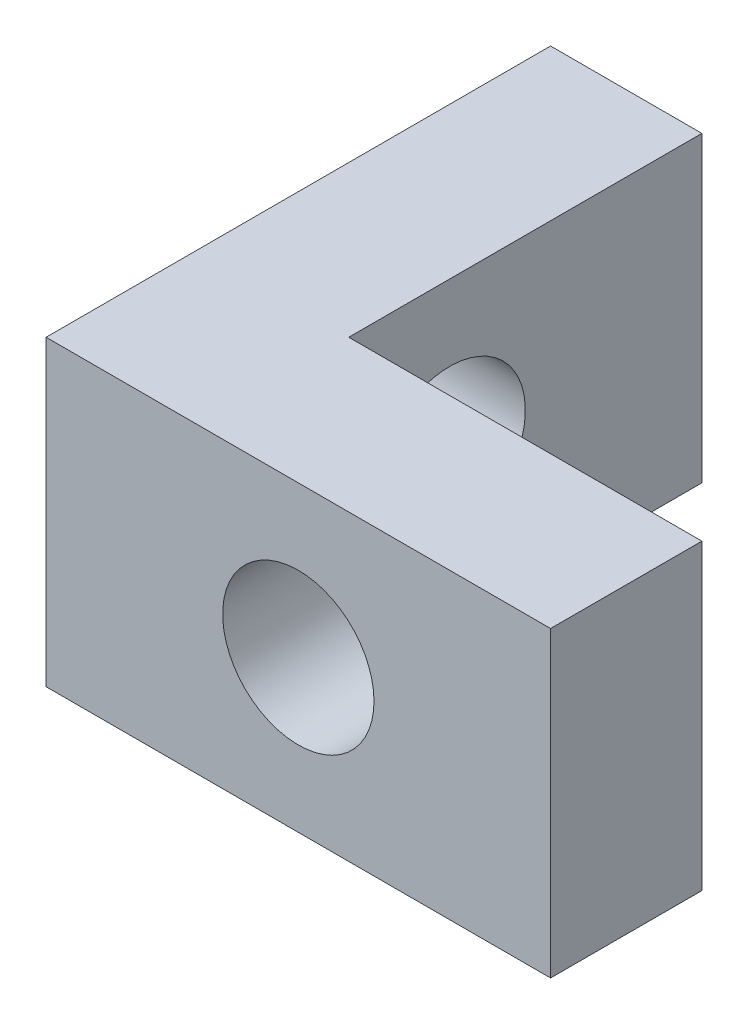
ISO-10303-21;
HEADER;
FILE_DESCRIPTION(('STEP AP214'),'2;1');
FILE_NAME('part.step','',(''),(''),'','','');
FILE_SCHEMA(('AUTOMOTIVE_DESIGN { 1 0 10303 214 1 1 1 1 }'));
ENDSEC;
DATA;
#1=APPLICATION_CONTEXT('core data for automotive mechanical design processes');
#2=APPLICATION_PROTOCOL_DEFINITION('international standard','automotive_design',2000,#1);
#3=PRODUCT_CONTEXT('',#1,'mechanical');
#4=PRODUCT('Part','Part','',(#3));
#5=PRODUCT_RELATED_PRODUCT_CATEGORY('part','',(#4));
#6=PRODUCT_DEFINITION_FORMATION('','',#4);
#7=PRODUCT_DEFINITION_CONTEXT('part definition',#1,'design');
#8=PRODUCT_DEFINITION('design','',#6,#7);
#9=PRODUCT_DEFINITION_SHAPE('','',#8);
#10=(LENGTH_UNIT() NAMED_UNIT(*) SI_UNIT(.MILLI.,.METRE.));
#11=(NAMED_UNIT(*) PLANE_ANGLE_UNIT() SI_UNIT($,.RADIAN.));
#12=(NAMED_UNIT(*) SI_UNIT($,.STERADIAN.) SOLID_ANGLE_UNIT());
#13=UNCERTAINTY_MEASURE_WITH_UNIT(LENGTH_MEASURE(1.E-05),#10,'distance_accuracy_value','');
#14=(GEOMETRIC_REPRESENTATION_CONTEXT(3) GLOBAL_UNCERTAINTY_ASSIGNED_CONTEXT((#13)) GLOBAL_UNIT_ASSIGNED_CONTEXT((#10,
#11,#12)) REPRESENTATION_CONTEXT('',''));
#15=CARTESIAN_POINT('',(0.,0.,0.));
#16=DIRECTION('',(0.,0.,1.));
#17=DIRECTION('',(1.,0.,0.));
#18=AXIS2_PLACEMENT_3D('',#15,#16,#17);
#19=CARTESIAN_POINT('',(0.,6.,0.));
#20=DIRECTION('',(1.,0.,0.));
#21=DIRECTION('',(0.,0.,-1.));
#22=AXIS2_PLACEMENT_3D('',#19,#20,#21);
#23=PLANE('',#22);
#24=CARTESIAN_POINT('',(0.,3.,-5.));
#25=DIRECTION('',(-1.,0.,0.));
#26=DIRECTION('',(0.,0.,1.));
#27=AXIS2_PLACEMENT_3D('',#24,#25,#26);
#28=CIRCLE('',#27,1.5);
#29=CARTESIAN_POINT('',(0.,3.,-3.5));
#30=VERTEX_POINT('',#29);
#31=EDGE_CURVE('E155',#30,#30,#28,.T.);
#32=ORIENTED_EDGE('',*,*,#31,.F.);
#33=EDGE_LOOP('',(#32));
#34=FACE_BOUND('',#33,.T.);
#35=DIRECTION('',(0.,0.,1.));
#36=VECTOR('',#35,1.);
#37=CARTESIAN_POINT('',(0.,0.,0.));
#38=LINE('',#37,#36);
#39=CARTESIAN_POINT('',(0.,0.,-10.));
#40=VERTEX_POINT('',#39);
#41=CARTESIAN_POINT('',(0.,0.,0.));
#42=VERTEX_POINT('',#41);
#43=EDGE_CURVE('E130',#40,#42,#38,.T.);
#44=ORIENTED_EDGE('',*,*,#43,.T.);
#45=DIRECTION('',(0.,-1.,0.));
#46=VECTOR('',#45,1.);
#47=CARTESIAN_POINT('',(0.,6.,0.));
#48=LINE('',#47,#46);
#49=CARTESIAN_POINT('',(0.,6.,0.));
#50=VERTEX_POINT('',#49);
#51=EDGE_CURVE('E11',#50,#42,#48,.T.);
#52=ORIENTED_EDGE('',*,*,#51,.F.);
#53=DIRECTION('',(0.,0.,1.));
#54=VECTOR('',#53,1.);
#55=CARTESIAN_POINT('',(0.,6.,0.));
#56=LINE('',#55,#54);
#57=CARTESIAN_POINT('',(0.,6.,-10.));
#58=VERTEX_POINT('',#57);
#59=EDGE_CURVE('E137',#58,#50,#56,.T.);
#60=ORIENTED_EDGE('',*,*,#59,.F.);
#61=DIRECTION('',(0.,-1.,0.));
#62=VECTOR('',#61,1.);
#63=CARTESIAN_POINT('',(0.,6.,-10.));
#64=LINE('',#63,#62);
#65=EDGE_CURVE('E122',#58,#40,#64,.T.);
#66=ORIENTED_EDGE('',*,*,#65,.T.);
#67=EDGE_LOOP('',(#44,#52,#60,#66));
#68=FACE_BOUND('',#67,.T.);
#69=ADVANCED_FACE('F41',(#34,#68),#23,.F.);
#70=CARTESIAN_POINT('',(0.,6.,0.));
#71=DIRECTION('',(0.,0.,-1.));
#72=DIRECTION('',(-1.,0.,0.));
#73=AXIS2_PLACEMENT_3D('',#70,#71,#72);
#74=PLANE('',#73);
#75=CARTESIAN_POINT('',(5.,3.,0.));
#76=DIRECTION('',(0.,0.,1.));
#77=DIRECTION('',(1.,0.,0.));
#78=AXIS2_PLACEMENT_3D('',#75,#76,#77);
#79=CIRCLE('',#78,1.5);
#80=CARTESIAN_POINT('',(6.5,3.,0.));
#81=VERTEX_POINT('',#80);
#82=EDGE_CURVE('E145',#81,#81,#79,.T.);
#83=ORIENTED_EDGE('',*,*,#82,.F.);
#84=EDGE_LOOP('',(#83));
#85=FACE_BOUND('',#84,.T.);
#86=DIRECTION('',(1.,0.,0.));
#87=VECTOR('',#86,1.);
#88=CARTESIAN_POINT('',(0.,0.,0.));
#89=LINE('',#88,#87);
#90=CARTESIAN_POINT('',(10.,0.,0.));
#91=VERTEX_POINT('',#90);
#92=EDGE_CURVE('E128',#42,#91,#89,.T.);
#93=ORIENTED_EDGE('',*,*,#92,.T.);
#94=DIRECTION('',(0.,-1.,0.));
#95=VECTOR('',#94,1.);
#96=CARTESIAN_POINT('',(10.,6.,0.));
#97=LINE('',#96,#95);
#98=CARTESIAN_POINT('',(10.,6.,0.));
#99=VERTEX_POINT('',#98);
#100=EDGE_CURVE('E49',#99,#91,#97,.T.);
#101=ORIENTED_EDGE('',*,*,#100,.F.);
#102=DIRECTION('',(1.,0.,0.));
#103=VECTOR('',#102,1.);
#104=CARTESIAN_POINT('',(0.,6.,0.));
#105=LINE('',#104,#103);
#106=EDGE_CURVE('E96',#50,#99,#105,.T.);
#107=ORIENTED_EDGE('',*,*,#106,.F.);
#108=ORIENTED_EDGE('',*,*,#51,.T.);
#109=EDGE_LOOP('',(#93,#101,#107,#108));
#110=FACE_BOUND('',#109,.T.);
#111=ADVANCED_FACE('F158',(#85,#110),#74,.F.);
#112=CARTESIAN_POINT('',(10.,6.,0.));
#113=DIRECTION('',(-1.,0.,0.));
#114=DIRECTION('',(0.,0.,1.));
#115=AXIS2_PLACEMENT_3D('',#112,#113,#114);
#116=PLANE('',#115);
#117=DIRECTION('',(0.,0.,-1.));
#118=VECTOR('',#117,1.);
#119=CARTESIAN_POINT('',(10.,0.,0.));
#120=LINE('',#119,#118);
#121=CARTESIAN_POINT('',(10.,0.,-3.));
#122=VERTEX_POINT('',#121);
#123=EDGE_CURVE('E132',#91,#122,#120,.T.);
#124=ORIENTED_EDGE('',*,*,#123,.T.);
#125=DIRECTION('',(0.,-1.,0.));
#126=VECTOR('',#125,1.);
#127=CARTESIAN_POINT('',(10.,6.,-3.));
#128=LINE('',#127,#126);
#129=CARTESIAN_POINT('',(10.,6.,-3.));
#130=VERTEX_POINT('',#129);
#131=EDGE_CURVE('E117',#130,#122,#128,.T.);
#132=ORIENTED_EDGE('',*,*,#131,.F.);
#133=DIRECTION('',(0.,0.,-1.));
#134=VECTOR('',#133,1.);
#135=CARTESIAN_POINT('',(10.,6.,0.));
#136=LINE('',#135,#134);
#137=EDGE_CURVE('E108',#99,#130,#136,.T.);
#138=ORIENTED_EDGE('',*,*,#137,.F.);
#139=ORIENTED_EDGE('',*,*,#100,.T.);
#140=EDGE_LOOP('',(#124,#132,#138,#139));
#141=FACE_BOUND('',#140,.T.);
#142=ADVANCED_FACE('F161',(#141),#116,.F.);
#143=CARTESIAN_POINT('',(10.,6.,-3.));
#144=DIRECTION('',(0.,0.,1.));
#145=DIRECTION('',(1.,0.,0.));
#146=AXIS2_PLACEMENT_3D('',#143,#144,#145);
#147=PLANE('',#146);
#148=CARTESIAN_POINT('',(5.,3.,-3.));
#149=DIRECTION('',(0.,0.,1.));
#150=DIRECTION('',(1.,0.,0.));
#151=AXIS2_PLACEMENT_3D('',#148,#149,#150);
#152=CIRCLE('',#151,1.5);
#153=CARTESIAN_POINT('',(6.5,3.,-3.));
#154=VERTEX_POINT('',#153);
#155=EDGE_CURVE('E133',#154,#154,#152,.T.);
#156=ORIENTED_EDGE('',*,*,#155,.T.);
#157=EDGE_LOOP('',(#156));
#158=FACE_BOUND('',#157,.T.);
#159=DIRECTION('',(-1.,0.,0.));
#160=VECTOR('',#159,1.);
#161=CARTESIAN_POINT('',(10.,0.,-3.));
#162=LINE('',#161,#160);
#163=CARTESIAN_POINT('',(3.,0.,-3.));
#164=VERTEX_POINT('',#163);
#165=EDGE_CURVE('E119',#122,#164,#162,.T.);
#166=ORIENTED_EDGE('',*,*,#165,.T.);
#167=DIRECTION('',(0.,-1.,0.));
#168=VECTOR('',#167,1.);
#169=CARTESIAN_POINT('',(3.,6.,-3.));
#170=LINE('',#169,#168);
#171=CARTESIAN_POINT('',(3.,6.,-3.));
#172=VERTEX_POINT('',#171);
#173=EDGE_CURVE('E111',#172,#164,#170,.T.);
#174=ORIENTED_EDGE('',*,*,#173,.F.);
#175=DIRECTION('',(-1.,0.,0.));
#176=VECTOR('',#175,1.);
#177=CARTESIAN_POINT('',(10.,6.,-3.));
#178=LINE('',#177,#176);
#179=EDGE_CURVE('E103',#130,#172,#178,.T.);
#180=ORIENTED_EDGE('',*,*,#179,.F.);
#181=ORIENTED_EDGE('',*,*,#131,.T.);
#182=EDGE_LOOP('',(#166,#174,#180,#181));
#183=FACE_BOUND('',#182,.T.);
#184=ADVANCED_FACE('F113',(#158,#183),#147,.F.);
#185=CARTESIAN_POINT('',(3.,6.,-10.));
#186=DIRECTION('',(-1.,0.,0.));
#187=DIRECTION('',(0.,0.,1.));
#188=AXIS2_PLACEMENT_3D('',#185,#186,#187);
#189=PLANE('',#188);
#190=CARTESIAN_POINT('',(3.,3.,-5.));
#191=DIRECTION('',(-1.,0.,0.));
#192=DIRECTION('',(0.,0.,1.));
#193=AXIS2_PLACEMENT_3D('',#190,#191,#192);
#194=CIRCLE('',#193,1.5);
#195=CARTESIAN_POINT('',(3.,3.,-3.5));
#196=VERTEX_POINT('',#195);
#197=EDGE_CURVE('E42',#196,#196,#194,.T.);
#198=ORIENTED_EDGE('',*,*,#197,.T.);
#199=EDGE_LOOP('',(#198));
#200=FACE_BOUND('',#199,.T.);
#201=DIRECTION('',(0.,0.,-1.));
#202=VECTOR('',#201,1.);
#203=CARTESIAN_POINT('',(3.,0.,-10.));
#204=LINE('',#203,#202);
#205=CARTESIAN_POINT('',(3.,0.,-10.));
#206=VERTEX_POINT('',#205);
#207=EDGE_CURVE('E85',#164,#206,#204,.T.);
#208=ORIENTED_EDGE('',*,*,#207,.T.);
#209=DIRECTION('',(0.,-1.,0.));
#210=VECTOR('',#209,1.);
#211=CARTESIAN_POINT('',(3.,6.,-10.));
#212=LINE('',#211,#210);
#213=CARTESIAN_POINT('',(3.,6.,-10.));
#214=VERTEX_POINT('',#213);
#215=EDGE_CURVE('E120',#214,#206,#212,.T.);
#216=ORIENTED_EDGE('',*,*,#215,.F.);
#217=DIRECTION('',(0.,0.,-1.));
#218=VECTOR('',#217,1.);
#219=CARTESIAN_POINT('',(3.,6.,-10.));
#220=LINE('',#219,#218);
#221=EDGE_CURVE('E110',#172,#214,#220,.T.);
#222=ORIENTED_EDGE('',*,*,#221,.F.);
#223=ORIENTED_EDGE('',*,*,#173,.T.);
#224=EDGE_LOOP('',(#208,#216,#222,#223));
#225=FACE_BOUND('',#224,.T.);
#226=ADVANCED_FACE('F121',(#200,#225),#189,.F.);
#227=CARTESIAN_POINT('',(0.,6.,-10.));
#228=DIRECTION('',(0.,0.,1.));
#229=DIRECTION('',(1.,0.,0.));
#230=AXIS2_PLACEMENT_3D('',#227,#228,#229);
#231=PLANE('',#230);
#232=DIRECTION('',(-1.,0.,0.));
#233=VECTOR('',#232,1.);
#234=CARTESIAN_POINT('',(0.,0.,-10.));
#235=LINE('',#234,#233);
#236=EDGE_CURVE('E86',#206,#40,#235,.T.);
#237=ORIENTED_EDGE('',*,*,#236,.T.);
#238=ORIENTED_EDGE('',*,*,#65,.F.);
#239=DIRECTION('',(-1.,0.,0.));
#240=VECTOR('',#239,1.);
#241=CARTESIAN_POINT('',(0.,6.,-10.));
#242=LINE('',#241,#240);
#243=EDGE_CURVE('E56',#214,#58,#242,.T.);
#244=ORIENTED_EDGE('',*,*,#243,.F.);
#245=ORIENTED_EDGE('',*,*,#215,.T.);
#246=EDGE_LOOP('',(#237,#238,#244,#245));
#247=FACE_BOUND('',#246,.T.);
#248=ADVANCED_FACE('F167',(#247),#231,.F.);
#249=CARTESIAN_POINT('',(0.,6.,0.));
#250=DIRECTION('',(0.,-1.,0.));
#251=DIRECTION('',(0.,0.,-1.));
#252=AXIS2_PLACEMENT_3D('',#249,#250,#251);
#253=PLANE('',#252);
#254=ORIENTED_EDGE('',*,*,#59,.T.);
#255=ORIENTED_EDGE('',*,*,#106,.T.);
#256=ORIENTED_EDGE('',*,*,#137,.T.);
#257=ORIENTED_EDGE('',*,*,#179,.T.);
#258=ORIENTED_EDGE('',*,*,#221,.T.);
#259=ORIENTED_EDGE('',*,*,#243,.T.);
#260=EDGE_LOOP('',(#254,#255,#256,#257,#258,#259));
#261=FACE_BOUND('',#260,.T.);
#262=ADVANCED_FACE('F104',(#261),#253,.F.);
#263=CARTESIAN_POINT('',(0.,0.,0.));
#264=DIRECTION('',(0.,-1.,0.));
#265=DIRECTION('',(0.,0.,-1.));
#266=AXIS2_PLACEMENT_3D('',#263,#264,#265);
#267=PLANE('',#266);
#268=ORIENTED_EDGE('',*,*,#43,.F.);
#269=ORIENTED_EDGE('',*,*,#236,.F.);
#270=ORIENTED_EDGE('',*,*,#207,.F.);
#271=ORIENTED_EDGE('',*,*,#165,.F.);
#272=ORIENTED_EDGE('',*,*,#123,.F.);
#273=ORIENTED_EDGE('',*,*,#92,.F.);
#274=EDGE_LOOP('',(#268,#269,#270,#271,#272,#273));
#275=FACE_BOUND('',#274,.T.);
#276=ADVANCED_FACE('F163',(#275),#267,.T.);
#277=CARTESIAN_POINT('',(5.,3.,-6.));
#278=DIRECTION('',(0.,0.,1.));
#279=DIRECTION('',(1.,0.,0.));
#280=AXIS2_PLACEMENT_3D('',#277,#278,#279);
#281=CYLINDRICAL_SURFACE('',#280,1.5);
#282=ORIENTED_EDGE('',*,*,#82,.T.);
#283=EDGE_LOOP('',(#282));
#284=FACE_BOUND('',#283,.T.);
#285=ORIENTED_EDGE('',*,*,#155,.F.);
#286=EDGE_LOOP('',(#285));
#287=FACE_BOUND('',#286,.T.);
#288=ADVANCED_FACE('F191',(#284,#287),#281,.F.);
#289=CARTESIAN_POINT('',(6.,3.,-5.));
#290=DIRECTION('',(-1.,0.,0.));
#291=DIRECTION('',(0.,0.,1.));
#292=AXIS2_PLACEMENT_3D('',#289,#290,#291);
#293=CYLINDRICAL_SURFACE('',#292,1.5);
#294=ORIENTED_EDGE('',*,*,#31,.T.);
#295=EDGE_LOOP('',(#294));
#296=FACE_BOUND('',#295,.T.);
#297=ORIENTED_EDGE('',*,*,#197,.F.);
#298=EDGE_LOOP('',(#297));
#299=FACE_BOUND('',#298,.T.);
#300=ADVANCED_FACE('F187',(#296,#299),#293,.F.);
#301=CLOSED_SHELL('',(#69,#111,#142,#184,#226,#248,#262,#276,#288,#300));
#302=MANIFOLD_SOLID_BREP('B2',#301);
#303=ADVANCED_BREP_SHAPE_REPRESENTATION('',(#18,#302),#14);
#304=SHAPE_DEFINITION_REPRESENTATION(#9,#303);
ENDSEC;
END-ISO-10303-21;
